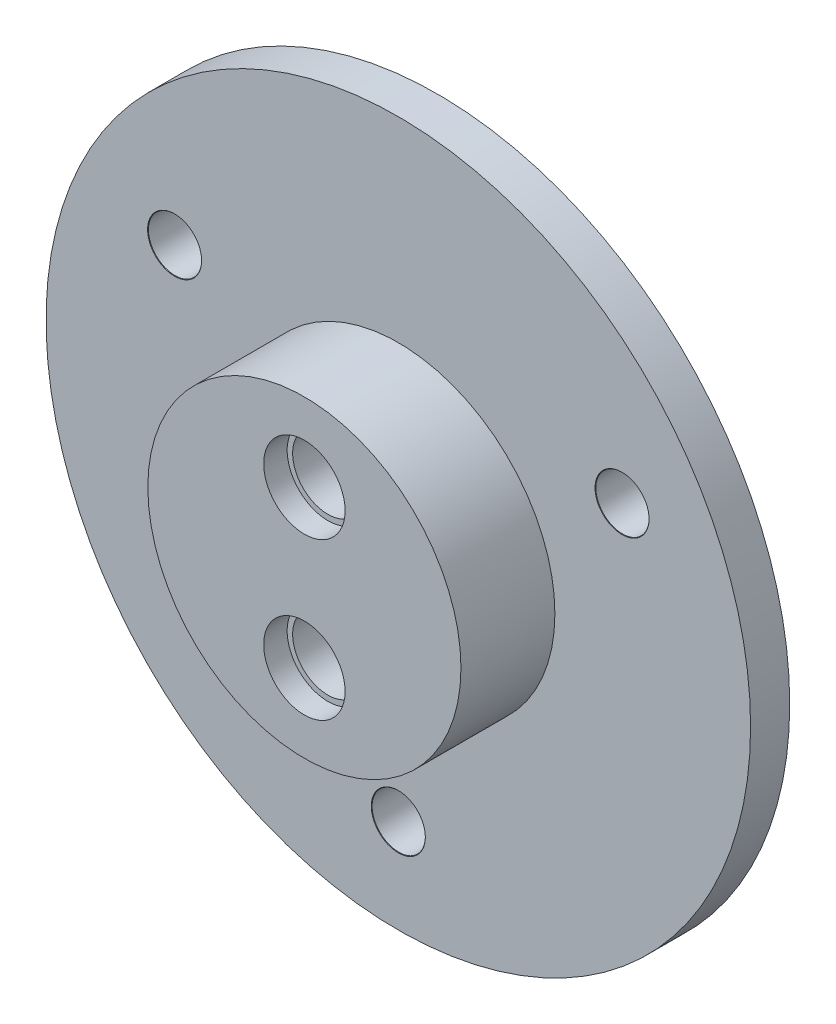
ISO-10303-21;
HEADER;
FILE_DESCRIPTION(('STEP AP214'),'2;1');
FILE_NAME('part.step','',(''),(''),'','','');
FILE_SCHEMA(('AUTOMOTIVE_DESIGN { 1 0 10303 214 1 1 1 1 }'));
ENDSEC;
DATA;
#1=APPLICATION_CONTEXT('core data for automotive mechanical design processes');
#2=APPLICATION_PROTOCOL_DEFINITION('international standard','automotive_design',2000,#1);
#3=PRODUCT_CONTEXT('',#1,'mechanical');
#4=PRODUCT('Part','Part','',(#3));
#5=PRODUCT_RELATED_PRODUCT_CATEGORY('part','',(#4));
#6=PRODUCT_DEFINITION_FORMATION('','',#4);
#7=PRODUCT_DEFINITION_CONTEXT('part definition',#1,'design');
#8=PRODUCT_DEFINITION('design','',#6,#7);
#9=PRODUCT_DEFINITION_SHAPE('','',#8);
#10=(LENGTH_UNIT() NAMED_UNIT(*) SI_UNIT(.MILLI.,.METRE.));
#11=(NAMED_UNIT(*) PLANE_ANGLE_UNIT() SI_UNIT($,.RADIAN.));
#12=(NAMED_UNIT(*) SI_UNIT($,.STERADIAN.) SOLID_ANGLE_UNIT());
#13=UNCERTAINTY_MEASURE_WITH_UNIT(LENGTH_MEASURE(1.E-05),#10,'distance_accuracy_value','');
#14=(GEOMETRIC_REPRESENTATION_CONTEXT(3) GLOBAL_UNCERTAINTY_ASSIGNED_CONTEXT((#13)) GLOBAL_UNIT_ASSIGNED_CONTEXT((#10,
#11,#12)) REPRESENTATION_CONTEXT('',''));
#15=CARTESIAN_POINT('',(0.,0.,0.));
#16=DIRECTION('',(0.,0.,1.));
#17=DIRECTION('',(1.,0.,0.));
#18=AXIS2_PLACEMENT_3D('',#15,#16,#17);
#19=CARTESIAN_POINT('',(0.,0.,2.5));
#20=DIRECTION('',(0.,0.,-1.));
#21=DIRECTION('',(-1.,0.,0.));
#22=AXIS2_PLACEMENT_3D('',#19,#20,#21);
#23=CYLINDRICAL_SURFACE('',#22,22.5);
#24=CARTESIAN_POINT('',(0.,0.,2.5));
#25=DIRECTION('',(0.,0.,1.));
#26=DIRECTION('',(1.,0.,0.));
#27=AXIS2_PLACEMENT_3D('',#24,#25,#26);
#28=CIRCLE('',#27,22.5);
#29=CARTESIAN_POINT('',(22.5,0.,2.5));
#30=VERTEX_POINT('',#29);
#31=EDGE_CURVE('E10',#30,#30,#28,.T.);
#32=ORIENTED_EDGE('',*,*,#31,.F.);
#33=EDGE_LOOP('',(#32));
#34=FACE_BOUND('',#33,.T.);
#35=CARTESIAN_POINT('',(0.,0.,0.));
#36=DIRECTION('',(0.,0.,1.));
#37=DIRECTION('',(1.,0.,0.));
#38=AXIS2_PLACEMENT_3D('',#35,#36,#37);
#39=CIRCLE('',#38,22.5);
#40=CARTESIAN_POINT('',(22.5,0.,0.));
#41=VERTEX_POINT('',#40);
#42=EDGE_CURVE('E42',#41,#41,#39,.T.);
#43=ORIENTED_EDGE('',*,*,#42,.T.);
#44=EDGE_LOOP('',(#43));
#45=FACE_BOUND('',#44,.T.);
#46=ADVANCED_FACE('F39',(#34,#45),#23,.T.);
#47=CARTESIAN_POINT('',(0.,0.,2.5));
#48=DIRECTION('',(0.,0.,1.));
#49=DIRECTION('',(1.,0.,0.));
#50=AXIS2_PLACEMENT_3D('',#47,#48,#49);
#51=PLANE('',#50);
#52=CARTESIAN_POINT('',(0.,0.,2.5));
#53=DIRECTION('',(0.,0.,1.));
#54=DIRECTION('',(1.,0.,0.));
#55=AXIS2_PLACEMENT_3D('',#52,#53,#54);
#56=CIRCLE('',#55,10.);
#57=CARTESIAN_POINT('',(10.,0.,2.5));
#58=VERTEX_POINT('',#57);
#59=EDGE_CURVE('E78',#58,#58,#56,.T.);
#60=ORIENTED_EDGE('',*,*,#59,.F.);
#61=EDGE_LOOP('',(#60));
#62=FACE_BOUND('',#61,.T.);
#63=CARTESIAN_POINT('',(-14.2894191624433,8.24999999999996,2.5));
#64=DIRECTION('',(0.,0.,1.));
#65=DIRECTION('',(1.,0.,0.));
#66=AXIS2_PLACEMENT_3D('',#63,#64,#65);
#67=CIRCLE('',#66,1.725);
#68=CARTESIAN_POINT('',(-12.5644191624433,8.24999999999996,2.5));
#69=VERTEX_POINT('',#68);
#70=EDGE_CURVE('E74',#69,#69,#67,.T.);
#71=ORIENTED_EDGE('',*,*,#70,.F.);
#72=EDGE_LOOP('',(#71));
#73=FACE_BOUND('',#72,.T.);
#74=CARTESIAN_POINT('',(14.2894191624432,8.25000000000007,2.5));
#75=DIRECTION('',(0.,0.,1.));
#76=DIRECTION('',(1.,0.,0.));
#77=AXIS2_PLACEMENT_3D('',#74,#75,#76);
#78=CIRCLE('',#77,1.725);
#79=CARTESIAN_POINT('',(16.0144191624432,8.25000000000007,2.5));
#80=VERTEX_POINT('',#79);
#81=EDGE_CURVE('E65',#80,#80,#78,.T.);
#82=ORIENTED_EDGE('',*,*,#81,.F.);
#83=EDGE_LOOP('',(#82));
#84=FACE_BOUND('',#83,.T.);
#85=CARTESIAN_POINT('',(0.,-16.5,2.5));
#86=DIRECTION('',(0.,0.,1.));
#87=DIRECTION('',(1.,0.,0.));
#88=AXIS2_PLACEMENT_3D('',#85,#86,#87);
#89=CIRCLE('',#88,1.725);
#90=CARTESIAN_POINT('',(1.725,-16.5,2.5));
#91=VERTEX_POINT('',#90);
#92=EDGE_CURVE('E56',#91,#91,#89,.T.);
#93=ORIENTED_EDGE('',*,*,#92,.F.);
#94=EDGE_LOOP('',(#93));
#95=FACE_BOUND('',#94,.T.);
#96=ORIENTED_EDGE('',*,*,#31,.T.);
#97=EDGE_LOOP('',(#96));
#98=FACE_BOUND('',#97,.T.);
#99=ADVANCED_FACE('F126',(#62,#73,#84,#95,#98),#51,.T.);
#100=CARTESIAN_POINT('',(0.,0.,0.));
#101=DIRECTION('',(0.,0.,1.));
#102=DIRECTION('',(1.,0.,0.));
#103=AXIS2_PLACEMENT_3D('',#100,#101,#102);
#104=PLANE('',#103);
#105=CARTESIAN_POINT('',(0.,5.,0.));
#106=DIRECTION('',(0.,0.,1.));
#107=DIRECTION('',(1.,0.,0.));
#108=AXIS2_PLACEMENT_3D('',#105,#106,#107);
#109=CIRCLE('',#108,2.25000000000001);
#110=CARTESIAN_POINT('',(2.25000000000001,5.,0.));
#111=VERTEX_POINT('',#110);
#112=EDGE_CURVE('E95',#111,#111,#109,.T.);
#113=ORIENTED_EDGE('',*,*,#112,.T.);
#114=EDGE_LOOP('',(#113));
#115=FACE_BOUND('',#114,.T.);
#116=CARTESIAN_POINT('',(0.,-5.,0.));
#117=DIRECTION('',(0.,0.,1.));
#118=DIRECTION('',(1.,0.,0.));
#119=AXIS2_PLACEMENT_3D('',#116,#117,#118);
#120=CIRCLE('',#119,2.25000000000001);
#121=CARTESIAN_POINT('',(2.25000000000001,-5.,0.));
#122=VERTEX_POINT('',#121);
#123=EDGE_CURVE('E81',#122,#122,#120,.T.);
#124=ORIENTED_EDGE('',*,*,#123,.T.);
#125=EDGE_LOOP('',(#124));
#126=FACE_BOUND('',#125,.T.);
#127=CARTESIAN_POINT('',(-14.2894191624433,8.24999999999996,0.));
#128=DIRECTION('',(0.,0.,1.));
#129=DIRECTION('',(1.,0.,0.));
#130=AXIS2_PLACEMENT_3D('',#127,#128,#129);
#131=CIRCLE('',#130,1.7);
#132=CARTESIAN_POINT('',(-12.5894191624433,8.24999999999996,0.));
#133=VERTEX_POINT('',#132);
#134=EDGE_CURVE('E68',#133,#133,#131,.T.);
#135=ORIENTED_EDGE('',*,*,#134,.T.);
#136=EDGE_LOOP('',(#135));
#137=FACE_BOUND('',#136,.T.);
#138=CARTESIAN_POINT('',(14.2894191624432,8.25000000000007,0.));
#139=DIRECTION('',(0.,0.,1.));
#140=DIRECTION('',(1.,0.,0.));
#141=AXIS2_PLACEMENT_3D('',#138,#139,#140);
#142=CIRCLE('',#141,1.7);
#143=CARTESIAN_POINT('',(15.9894191624432,8.25000000000007,0.));
#144=VERTEX_POINT('',#143);
#145=EDGE_CURVE('E59',#144,#144,#142,.T.);
#146=ORIENTED_EDGE('',*,*,#145,.T.);
#147=EDGE_LOOP('',(#146));
#148=FACE_BOUND('',#147,.T.);
#149=CARTESIAN_POINT('',(0.,-16.5,0.));
#150=DIRECTION('',(0.,0.,1.));
#151=DIRECTION('',(1.,0.,0.));
#152=AXIS2_PLACEMENT_3D('',#149,#150,#151);
#153=CIRCLE('',#152,1.7);
#154=CARTESIAN_POINT('',(1.7,-16.5,0.));
#155=VERTEX_POINT('',#154);
#156=EDGE_CURVE('E49',#155,#155,#153,.T.);
#157=ORIENTED_EDGE('',*,*,#156,.T.);
#158=EDGE_LOOP('',(#157));
#159=FACE_BOUND('',#158,.T.);
#160=ORIENTED_EDGE('',*,*,#42,.F.);
#161=EDGE_LOOP('',(#160));
#162=FACE_BOUND('',#161,.T.);
#163=ADVANCED_FACE('F129',(#115,#126,#137,#148,#159,#162),#104,.F.);
#164=CARTESIAN_POINT('',(0.,-16.5,2.5));
#165=DIRECTION('',(0.,0.,1.));
#166=DIRECTION('',(1.,0.,0.));
#167=AXIS2_PLACEMENT_3D('',#164,#165,#166);
#168=CYLINDRICAL_SURFACE('',#167,1.7);
#169=ORIENTED_EDGE('',*,*,#156,.F.);
#170=EDGE_LOOP('',(#169));
#171=FACE_BOUND('',#170,.T.);
#172=CARTESIAN_POINT('',(0.,-16.5,2.475));
#173=DIRECTION('',(0.,0.,1.));
#174=DIRECTION('',(1.,0.,0.));
#175=AXIS2_PLACEMENT_3D('',#172,#173,#174);
#176=CIRCLE('',#175,1.7);
#177=CARTESIAN_POINT('',(1.7,-16.5,2.475));
#178=VERTEX_POINT('',#177);
#179=EDGE_CURVE('E53',#178,#178,#176,.T.);
#180=ORIENTED_EDGE('',*,*,#179,.T.);
#181=EDGE_LOOP('',(#180));
#182=FACE_BOUND('',#181,.T.);
#183=ADVANCED_FACE('F140',(#171,#182),#168,.F.);
#184=CARTESIAN_POINT('',(0.,-16.5,2.5));
#185=DIRECTION('',(0.,0.,1.));
#186=DIRECTION('',(1.,0.,0.));
#187=AXIS2_PLACEMENT_3D('',#184,#185,#186);
#188=CONICAL_SURFACE('',#187,1.725,0.785398163397422);
#189=ORIENTED_EDGE('',*,*,#179,.F.);
#190=EDGE_LOOP('',(#189));
#191=FACE_BOUND('',#190,.T.);
#192=ORIENTED_EDGE('',*,*,#92,.T.);
#193=EDGE_LOOP('',(#192));
#194=FACE_BOUND('',#193,.T.);
#195=ADVANCED_FACE('F137',(#191,#194),#188,.F.);
#196=CARTESIAN_POINT('',(14.2894191624432,8.25000000000007,2.5));
#197=DIRECTION('',(0.,0.,1.));
#198=DIRECTION('',(1.,0.,0.));
#199=AXIS2_PLACEMENT_3D('',#196,#197,#198);
#200=CYLINDRICAL_SURFACE('',#199,1.7);
#201=ORIENTED_EDGE('',*,*,#145,.F.);
#202=EDGE_LOOP('',(#201));
#203=FACE_BOUND('',#202,.T.);
#204=CARTESIAN_POINT('',(14.2894191624432,8.25000000000007,2.475));
#205=DIRECTION('',(0.,0.,1.));
#206=DIRECTION('',(1.,0.,0.));
#207=AXIS2_PLACEMENT_3D('',#204,#205,#206);
#208=CIRCLE('',#207,1.7);
#209=CARTESIAN_POINT('',(15.9894191624432,8.25000000000007,2.475));
#210=VERTEX_POINT('',#209);
#211=EDGE_CURVE('E62',#210,#210,#208,.T.);
#212=ORIENTED_EDGE('',*,*,#211,.T.);
#213=EDGE_LOOP('',(#212));
#214=FACE_BOUND('',#213,.T.);
#215=ADVANCED_FACE('F139',(#203,#214),#200,.F.);
#216=CARTESIAN_POINT('',(14.2894191624432,8.25000000000007,2.5));
#217=DIRECTION('',(0.,0.,1.));
#218=DIRECTION('',(1.,0.,0.));
#219=AXIS2_PLACEMENT_3D('',#216,#217,#218);
#220=CONICAL_SURFACE('',#219,1.725,0.785398163397414);
#221=ORIENTED_EDGE('',*,*,#211,.F.);
#222=EDGE_LOOP('',(#221));
#223=FACE_BOUND('',#222,.T.);
#224=ORIENTED_EDGE('',*,*,#81,.T.);
#225=EDGE_LOOP('',(#224));
#226=FACE_BOUND('',#225,.T.);
#227=ADVANCED_FACE('F147',(#223,#226),#220,.F.);
#228=CARTESIAN_POINT('',(-14.2894191624433,8.24999999999996,2.5));
#229=DIRECTION('',(0.,0.,1.));
#230=DIRECTION('',(1.,0.,0.));
#231=AXIS2_PLACEMENT_3D('',#228,#229,#230);
#232=CYLINDRICAL_SURFACE('',#231,1.7);
#233=ORIENTED_EDGE('',*,*,#134,.F.);
#234=EDGE_LOOP('',(#233));
#235=FACE_BOUND('',#234,.T.);
#236=CARTESIAN_POINT('',(-14.2894191624433,8.24999999999996,2.475));
#237=DIRECTION('',(0.,0.,1.));
#238=DIRECTION('',(1.,0.,0.));
#239=AXIS2_PLACEMENT_3D('',#236,#237,#238);
#240=CIRCLE('',#239,1.7);
#241=CARTESIAN_POINT('',(-12.5894191624433,8.24999999999996,2.475));
#242=VERTEX_POINT('',#241);
#243=EDGE_CURVE('E71',#242,#242,#240,.T.);
#244=ORIENTED_EDGE('',*,*,#243,.T.);
#245=EDGE_LOOP('',(#244));
#246=FACE_BOUND('',#245,.T.);
#247=ADVANCED_FACE('F179',(#235,#246),#232,.F.);
#248=CARTESIAN_POINT('',(-14.2894191624433,8.24999999999996,2.5));
#249=DIRECTION('',(0.,0.,1.));
#250=DIRECTION('',(1.,0.,0.));
#251=AXIS2_PLACEMENT_3D('',#248,#249,#250);
#252=CONICAL_SURFACE('',#251,1.725,0.785398163397448);
#253=ORIENTED_EDGE('',*,*,#243,.F.);
#254=EDGE_LOOP('',(#253));
#255=FACE_BOUND('',#254,.T.);
#256=ORIENTED_EDGE('',*,*,#70,.T.);
#257=EDGE_LOOP('',(#256));
#258=FACE_BOUND('',#257,.T.);
#259=ADVANCED_FACE('F122',(#255,#258),#252,.F.);
#260=CARTESIAN_POINT('',(0.,0.,8.5));
#261=DIRECTION('',(0.,0.,-1.));
#262=DIRECTION('',(-1.,0.,0.));
#263=AXIS2_PLACEMENT_3D('',#260,#261,#262);
#264=CYLINDRICAL_SURFACE('',#263,10.);
#265=CARTESIAN_POINT('',(0.,0.,8.5));
#266=DIRECTION('',(0.,0.,1.));
#267=DIRECTION('',(1.,0.,0.));
#268=AXIS2_PLACEMENT_3D('',#265,#266,#267);
#269=CIRCLE('',#268,10.);
#270=CARTESIAN_POINT('',(10.,0.,8.5));
#271=VERTEX_POINT('',#270);
#272=EDGE_CURVE('E77',#271,#271,#269,.T.);
#273=ORIENTED_EDGE('',*,*,#272,.F.);
#274=EDGE_LOOP('',(#273));
#275=FACE_BOUND('',#274,.T.);
#276=ORIENTED_EDGE('',*,*,#59,.T.);
#277=EDGE_LOOP('',(#276));
#278=FACE_BOUND('',#277,.T.);
#279=ADVANCED_FACE('F114',(#275,#278),#264,.T.);
#280=CARTESIAN_POINT('',(0.,0.,8.5));
#281=DIRECTION('',(0.,0.,1.));
#282=DIRECTION('',(1.,0.,0.));
#283=AXIS2_PLACEMENT_3D('',#280,#281,#282);
#284=PLANE('',#283);
#285=CARTESIAN_POINT('',(0.,5.,8.5));
#286=DIRECTION('',(0.,0.,1.));
#287=DIRECTION('',(1.,0.,0.));
#288=AXIS2_PLACEMENT_3D('',#285,#286,#287);
#289=CIRCLE('',#288,2.60000000000001);
#290=CARTESIAN_POINT('',(2.60000000000001,5.,8.5));
#291=VERTEX_POINT('',#290);
#292=EDGE_CURVE('E104',#291,#291,#289,.T.);
#293=ORIENTED_EDGE('',*,*,#292,.F.);
#294=EDGE_LOOP('',(#293));
#295=FACE_BOUND('',#294,.T.);
#296=CARTESIAN_POINT('',(0.,-5.,8.5));
#297=DIRECTION('',(0.,0.,1.));
#298=DIRECTION('',(1.,0.,0.));
#299=AXIS2_PLACEMENT_3D('',#296,#297,#298);
#300=CIRCLE('',#299,2.60000000000001);
#301=CARTESIAN_POINT('',(2.60000000000001,-5.,8.5));
#302=VERTEX_POINT('',#301);
#303=EDGE_CURVE('E92',#302,#302,#300,.T.);
#304=ORIENTED_EDGE('',*,*,#303,.F.);
#305=EDGE_LOOP('',(#304));
#306=FACE_BOUND('',#305,.T.);
#307=ORIENTED_EDGE('',*,*,#272,.T.);
#308=EDGE_LOOP('',(#307));
#309=FACE_BOUND('',#308,.T.);
#310=ADVANCED_FACE('F110',(#295,#306,#309),#284,.T.);
#311=CARTESIAN_POINT('',(0.,-5.,8.5));
#312=DIRECTION('',(0.,0.,1.));
#313=DIRECTION('',(1.,0.,0.));
#314=AXIS2_PLACEMENT_3D('',#311,#312,#313);
#315=CYLINDRICAL_SURFACE('',#314,2.25000000000001);
#316=ORIENTED_EDGE('',*,*,#123,.F.);
#317=EDGE_LOOP('',(#316));
#318=FACE_BOUND('',#317,.T.);
#319=CARTESIAN_POINT('',(0.,-5.,7.));
#320=DIRECTION('',(0.,0.,1.));
#321=DIRECTION('',(1.,0.,0.));
#322=AXIS2_PLACEMENT_3D('',#319,#320,#321);
#323=CIRCLE('',#322,2.25000000000001);
#324=CARTESIAN_POINT('',(2.25000000000001,-5.,7.));
#325=VERTEX_POINT('',#324);
#326=EDGE_CURVE('E86',#325,#325,#323,.T.);
#327=ORIENTED_EDGE('',*,*,#326,.T.);
#328=EDGE_LOOP('',(#327));
#329=FACE_BOUND('',#328,.T.);
#330=ADVANCED_FACE('F113',(#318,#329),#315,.F.);
#331=CARTESIAN_POINT('',(2.25000000000001,-5.,7.));
#332=DIRECTION('',(0.,0.,-1.));
#333=DIRECTION('',(-1.,0.,0.));
#334=AXIS2_PLACEMENT_3D('',#331,#332,#333);
#335=PLANE('',#334);
#336=ORIENTED_EDGE('',*,*,#326,.F.);
#337=EDGE_LOOP('',(#336));
#338=FACE_BOUND('',#337,.T.);
#339=CARTESIAN_POINT('',(0.,-5.,7.));
#340=DIRECTION('',(0.,0.,1.));
#341=DIRECTION('',(1.,0.,0.));
#342=AXIS2_PLACEMENT_3D('',#339,#340,#341);
#343=CIRCLE('',#342,2.60000000000001);
#344=CARTESIAN_POINT('',(2.60000000000001,-5.,7.));
#345=VERTEX_POINT('',#344);
#346=EDGE_CURVE('E89',#345,#345,#343,.T.);
#347=ORIENTED_EDGE('',*,*,#346,.T.);
#348=EDGE_LOOP('',(#347));
#349=FACE_BOUND('',#348,.T.);
#350=ADVANCED_FACE('F192',(#338,#349),#335,.F.);
#351=CARTESIAN_POINT('',(0.,-5.,8.5));
#352=DIRECTION('',(0.,0.,1.));
#353=DIRECTION('',(1.,0.,0.));
#354=AXIS2_PLACEMENT_3D('',#351,#352,#353);
#355=CYLINDRICAL_SURFACE('',#354,2.60000000000001);
#356=ORIENTED_EDGE('',*,*,#346,.F.);
#357=EDGE_LOOP('',(#356));
#358=FACE_BOUND('',#357,.T.);
#359=ORIENTED_EDGE('',*,*,#303,.T.);
#360=EDGE_LOOP('',(#359));
#361=FACE_BOUND('',#360,.T.);
#362=ADVANCED_FACE('F196',(#358,#361),#355,.F.);
#363=CARTESIAN_POINT('',(0.,5.,8.5));
#364=DIRECTION('',(0.,0.,1.));
#365=DIRECTION('',(1.,0.,0.));
#366=AXIS2_PLACEMENT_3D('',#363,#364,#365);
#367=CYLINDRICAL_SURFACE('',#366,2.25000000000001);
#368=ORIENTED_EDGE('',*,*,#112,.F.);
#369=EDGE_LOOP('',(#368));
#370=FACE_BOUND('',#369,.T.);
#371=CARTESIAN_POINT('',(0.,5.,7.));
#372=DIRECTION('',(0.,0.,1.));
#373=DIRECTION('',(1.,0.,0.));
#374=AXIS2_PLACEMENT_3D('',#371,#372,#373);
#375=CIRCLE('',#374,2.25000000000001);
#376=CARTESIAN_POINT('',(2.25000000000001,5.,7.));
#377=VERTEX_POINT('',#376);
#378=EDGE_CURVE('E98',#377,#377,#375,.T.);
#379=ORIENTED_EDGE('',*,*,#378,.T.);
#380=EDGE_LOOP('',(#379));
#381=FACE_BOUND('',#380,.T.);
#382=ADVANCED_FACE('F200',(#370,#381),#367,.F.);
#383=CARTESIAN_POINT('',(2.25000000000001,5.,7.));
#384=DIRECTION('',(0.,0.,-1.));
#385=DIRECTION('',(-1.,0.,0.));
#386=AXIS2_PLACEMENT_3D('',#383,#384,#385);
#387=PLANE('',#386);
#388=ORIENTED_EDGE('',*,*,#378,.F.);
#389=EDGE_LOOP('',(#388));
#390=FACE_BOUND('',#389,.T.);
#391=CARTESIAN_POINT('',(0.,5.,7.));
#392=DIRECTION('',(0.,0.,1.));
#393=DIRECTION('',(1.,0.,0.));
#394=AXIS2_PLACEMENT_3D('',#391,#392,#393);
#395=CIRCLE('',#394,2.60000000000001);
#396=CARTESIAN_POINT('',(2.60000000000001,5.,7.));
#397=VERTEX_POINT('',#396);
#398=EDGE_CURVE('E101',#397,#397,#395,.T.);
#399=ORIENTED_EDGE('',*,*,#398,.T.);
#400=EDGE_LOOP('',(#399));
#401=FACE_BOUND('',#400,.T.);
#402=ADVANCED_FACE('F204',(#390,#401),#387,.F.);
#403=CARTESIAN_POINT('',(0.,5.,8.5));
#404=DIRECTION('',(0.,0.,1.));
#405=DIRECTION('',(1.,0.,0.));
#406=AXIS2_PLACEMENT_3D('',#403,#404,#405);
#407=CYLINDRICAL_SURFACE('',#406,2.60000000000001);
#408=ORIENTED_EDGE('',*,*,#398,.F.);
#409=EDGE_LOOP('',(#408));
#410=FACE_BOUND('',#409,.T.);
#411=ORIENTED_EDGE('',*,*,#292,.T.);
#412=EDGE_LOOP('',(#411));
#413=FACE_BOUND('',#412,.T.);
#414=ADVANCED_FACE('F108',(#410,#413),#407,.F.);
#415=CLOSED_SHELL('',(#46,#99,#163,#183,#195,#215,#227,#247,#259,#279,#310,#330,#350,#362,#382,
#402,#414));
#416=MANIFOLD_SOLID_BREP('B2',#415);
#417=ADVANCED_BREP_SHAPE_REPRESENTATION('',(#18,#416),#14);
#418=SHAPE_DEFINITION_REPRESENTATION(#9,#417);
ENDSEC;
END-ISO-10303-21;
